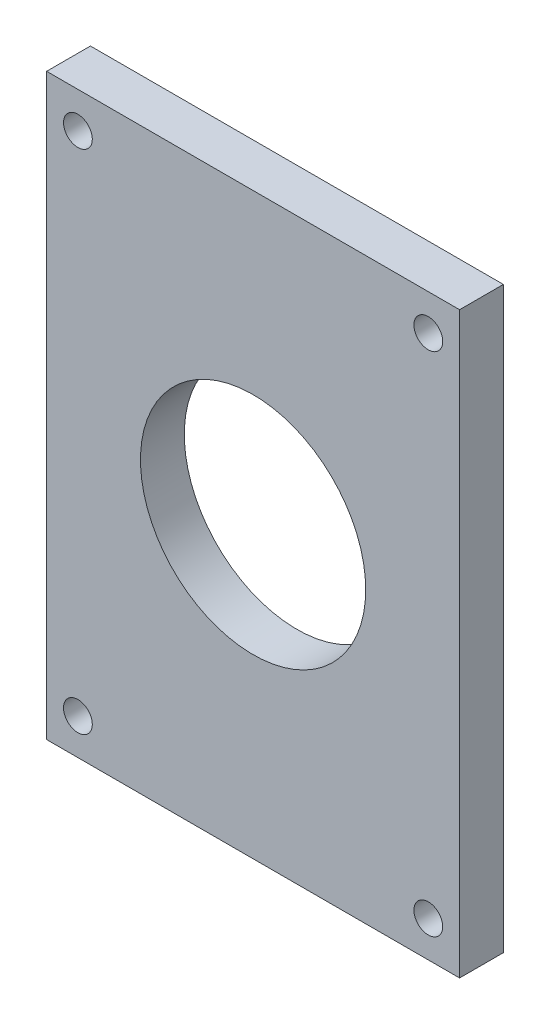
ISO-10303-21;
HEADER;
FILE_DESCRIPTION(('STEP AP214'),'2;1');
FILE_NAME('part.step','',(''),(''),'','','');
FILE_SCHEMA(('AUTOMOTIVE_DESIGN { 1 0 10303 214 1 1 1 1 }'));
ENDSEC;
DATA;
#1=APPLICATION_CONTEXT('core data for automotive mechanical design processes');
#2=APPLICATION_PROTOCOL_DEFINITION('international standard','automotive_design',2000,#1);
#3=PRODUCT_CONTEXT('',#1,'mechanical');
#4=PRODUCT('Part','Part','',(#3));
#5=PRODUCT_RELATED_PRODUCT_CATEGORY('part','',(#4));
#6=PRODUCT_DEFINITION_FORMATION('','',#4);
#7=PRODUCT_DEFINITION_CONTEXT('part definition',#1,'design');
#8=PRODUCT_DEFINITION('design','',#6,#7);
#9=PRODUCT_DEFINITION_SHAPE('','',#8);
#10=(LENGTH_UNIT() NAMED_UNIT(*) SI_UNIT(.MILLI.,.METRE.));
#11=(NAMED_UNIT(*) PLANE_ANGLE_UNIT() SI_UNIT($,.RADIAN.));
#12=(NAMED_UNIT(*) SI_UNIT($,.STERADIAN.) SOLID_ANGLE_UNIT());
#13=UNCERTAINTY_MEASURE_WITH_UNIT(LENGTH_MEASURE(1.E-05),#10,'distance_accuracy_value','');
#14=(GEOMETRIC_REPRESENTATION_CONTEXT(3) GLOBAL_UNCERTAINTY_ASSIGNED_CONTEXT((#13)) GLOBAL_UNIT_ASSIGNED_CONTEXT((#10,
#11,#12)) REPRESENTATION_CONTEXT('',''));
#15=CARTESIAN_POINT('',(0.,0.,0.));
#16=DIRECTION('',(0.,0.,1.));
#17=DIRECTION('',(1.,0.,0.));
#18=AXIS2_PLACEMENT_3D('',#15,#16,#17);
#19=CARTESIAN_POINT('',(0.,0.,65.));
#20=DIRECTION('',(0.,0.,1.));
#21=DIRECTION('',(1.,0.,0.));
#22=AXIS2_PLACEMENT_3D('',#19,#20,#21);
#23=PLANE('',#22);
#24=CARTESIAN_POINT('',(28.,-40.5,65.));
#25=DIRECTION('',(0.,0.,1.));
#26=DIRECTION('',(1.,0.,0.));
#27=AXIS2_PLACEMENT_3D('',#24,#25,#26);
#28=CIRCLE('',#27,2.3);
#29=CARTESIAN_POINT('',(30.3,-40.5,65.));
#30=VERTEX_POINT('',#29);
#31=EDGE_CURVE('E131',#30,#30,#28,.T.);
#32=ORIENTED_EDGE('',*,*,#31,.F.);
#33=EDGE_LOOP('',(#32));
#34=FACE_BOUND('',#33,.T.);
#35=CARTESIAN_POINT('',(-28.,-40.5,65.));
#36=DIRECTION('',(0.,0.,1.));
#37=DIRECTION('',(1.,0.,0.));
#38=AXIS2_PLACEMENT_3D('',#35,#36,#37);
#39=CIRCLE('',#38,2.3);
#40=CARTESIAN_POINT('',(-25.7,-40.5,65.));
#41=VERTEX_POINT('',#40);
#42=EDGE_CURVE('E122',#41,#41,#39,.T.);
#43=ORIENTED_EDGE('',*,*,#42,.F.);
#44=EDGE_LOOP('',(#43));
#45=FACE_BOUND('',#44,.T.);
#46=DIRECTION('',(0.,-1.,0.));
#47=VECTOR('',#46,1.);
#48=CARTESIAN_POINT('',(-33.,46.25,65.));
#49=LINE('',#48,#47);
#50=CARTESIAN_POINT('',(-33.,46.25,65.));
#51=VERTEX_POINT('',#50);
#52=CARTESIAN_POINT('',(-33.,-46.25,65.));
#53=VERTEX_POINT('',#52);
#54=EDGE_CURVE('E92',#51,#53,#49,.T.);
#55=ORIENTED_EDGE('',*,*,#54,.T.);
#56=DIRECTION('',(1.,0.,0.));
#57=VECTOR('',#56,1.);
#58=CARTESIAN_POINT('',(-33.,-46.25,65.));
#59=LINE('',#58,#57);
#60=CARTESIAN_POINT('',(33.,-46.25,65.));
#61=VERTEX_POINT('',#60);
#62=EDGE_CURVE('E88',#53,#61,#59,.T.);
#63=ORIENTED_EDGE('',*,*,#62,.T.);
#64=DIRECTION('',(0.,1.,0.));
#65=VECTOR('',#64,1.);
#66=CARTESIAN_POINT('',(33.,-46.25,65.));
#67=LINE('',#66,#65);
#68=CARTESIAN_POINT('',(33.,46.25,65.));
#69=VERTEX_POINT('',#68);
#70=EDGE_CURVE('E89',#61,#69,#67,.T.);
#71=ORIENTED_EDGE('',*,*,#70,.T.);
#72=DIRECTION('',(-1.,0.,0.));
#73=VECTOR('',#72,1.);
#74=CARTESIAN_POINT('',(33.,46.25,65.));
#75=LINE('',#74,#73);
#76=EDGE_CURVE('E57',#69,#51,#75,.T.);
#77=ORIENTED_EDGE('',*,*,#76,.T.);
#78=EDGE_LOOP('',(#55,#63,#71,#77));
#79=FACE_BOUND('',#78,.T.);
#80=CARTESIAN_POINT('',(0.,0.,65.));
#81=DIRECTION('',(0.,0.,1.));
#82=DIRECTION('',(1.,0.,0.));
#83=AXIS2_PLACEMENT_3D('',#80,#81,#82);
#84=CIRCLE('',#83,18.);
#85=CARTESIAN_POINT('',(18.,0.,65.));
#86=VERTEX_POINT('',#85);
#87=EDGE_CURVE('E106',#86,#86,#84,.T.);
#88=ORIENTED_EDGE('',*,*,#87,.F.);
#89=EDGE_LOOP('',(#88));
#90=FACE_BOUND('',#89,.T.);
#91=CARTESIAN_POINT('',(-28.,40.5,65.));
#92=DIRECTION('',(0.,0.,1.));
#93=DIRECTION('',(1.,0.,0.));
#94=AXIS2_PLACEMENT_3D('',#91,#92,#93);
#95=CIRCLE('',#94,2.3);
#96=CARTESIAN_POINT('',(-25.7,40.5,65.));
#97=VERTEX_POINT('',#96);
#98=EDGE_CURVE('E130',#97,#97,#95,.T.);
#99=ORIENTED_EDGE('',*,*,#98,.F.);
#100=EDGE_LOOP('',(#99));
#101=FACE_BOUND('',#100,.T.);
#102=CARTESIAN_POINT('',(28.,40.5,65.));
#103=DIRECTION('',(0.,0.,1.));
#104=DIRECTION('',(1.,0.,0.));
#105=AXIS2_PLACEMENT_3D('',#102,#103,#104);
#106=CIRCLE('',#105,2.3);
#107=CARTESIAN_POINT('',(30.3,40.5,65.));
#108=VERTEX_POINT('',#107);
#109=EDGE_CURVE('E139',#108,#108,#106,.T.);
#110=ORIENTED_EDGE('',*,*,#109,.F.);
#111=EDGE_LOOP('',(#110));
#112=FACE_BOUND('',#111,.T.);
#113=ADVANCED_FACE('F39',(#34,#45,#79,#90,#101,#112),#23,.T.);
#114=CARTESIAN_POINT('',(0.,0.,58.));
#115=DIRECTION('',(0.,0.,1.));
#116=DIRECTION('',(1.,0.,0.));
#117=AXIS2_PLACEMENT_3D('',#114,#115,#116);
#118=PLANE('',#117);
#119=DIRECTION('',(0.,-1.,0.));
#120=VECTOR('',#119,1.);
#121=CARTESIAN_POINT('',(-33.,46.25,58.));
#122=LINE('',#121,#120);
#123=CARTESIAN_POINT('',(-33.,46.25,58.));
#124=VERTEX_POINT('',#123);
#125=CARTESIAN_POINT('',(-33.,-46.25,58.));
#126=VERTEX_POINT('',#125);
#127=EDGE_CURVE('E101',#124,#126,#122,.T.);
#128=ORIENTED_EDGE('',*,*,#127,.F.);
#129=DIRECTION('',(-1.,0.,0.));
#130=VECTOR('',#129,1.);
#131=CARTESIAN_POINT('',(33.,46.25,58.));
#132=LINE('',#131,#130);
#133=CARTESIAN_POINT('',(33.,46.25,58.));
#134=VERTEX_POINT('',#133);
#135=EDGE_CURVE('E79',#134,#124,#132,.T.);
#136=ORIENTED_EDGE('',*,*,#135,.F.);
#137=DIRECTION('',(0.,1.,0.));
#138=VECTOR('',#137,1.);
#139=CARTESIAN_POINT('',(33.,-46.25,58.));
#140=LINE('',#139,#138);
#141=CARTESIAN_POINT('',(33.,-46.25,58.));
#142=VERTEX_POINT('',#141);
#143=EDGE_CURVE('E73',#142,#134,#140,.T.);
#144=ORIENTED_EDGE('',*,*,#143,.F.);
#145=DIRECTION('',(1.,0.,0.));
#146=VECTOR('',#145,1.);
#147=CARTESIAN_POINT('',(-33.,-46.25,58.));
#148=LINE('',#147,#146);
#149=EDGE_CURVE('E91',#126,#142,#148,.T.);
#150=ORIENTED_EDGE('',*,*,#149,.F.);
#151=EDGE_LOOP('',(#128,#136,#144,#150));
#152=FACE_BOUND('',#151,.T.);
#153=CARTESIAN_POINT('',(0.,0.,58.));
#154=DIRECTION('',(0.,0.,1.));
#155=DIRECTION('',(1.,0.,0.));
#156=AXIS2_PLACEMENT_3D('',#153,#154,#155);
#157=CIRCLE('',#156,18.);
#158=CARTESIAN_POINT('',(18.,0.,58.));
#159=VERTEX_POINT('',#158);
#160=EDGE_CURVE('E117',#159,#159,#157,.T.);
#161=ORIENTED_EDGE('',*,*,#160,.T.);
#162=EDGE_LOOP('',(#161));
#163=FACE_BOUND('',#162,.T.);
#164=CARTESIAN_POINT('',(-28.,-40.5,58.));
#165=DIRECTION('',(0.,0.,1.));
#166=DIRECTION('',(1.,0.,0.));
#167=AXIS2_PLACEMENT_3D('',#164,#165,#166);
#168=CIRCLE('',#167,2.3);
#169=CARTESIAN_POINT('',(-25.7,-40.5,58.));
#170=VERTEX_POINT('',#169);
#171=EDGE_CURVE('E121',#170,#170,#168,.T.);
#172=ORIENTED_EDGE('',*,*,#171,.T.);
#173=EDGE_LOOP('',(#172));
#174=FACE_BOUND('',#173,.T.);
#175=CARTESIAN_POINT('',(-28.,40.5,58.));
#176=DIRECTION('',(0.,0.,1.));
#177=DIRECTION('',(1.,0.,0.));
#178=AXIS2_PLACEMENT_3D('',#175,#176,#177);
#179=CIRCLE('',#178,2.3);
#180=CARTESIAN_POINT('',(-25.7,40.5,58.));
#181=VERTEX_POINT('',#180);
#182=EDGE_CURVE('E128',#181,#181,#179,.T.);
#183=ORIENTED_EDGE('',*,*,#182,.T.);
#184=EDGE_LOOP('',(#183));
#185=FACE_BOUND('',#184,.T.);
#186=CARTESIAN_POINT('',(28.,-40.5,58.));
#187=DIRECTION('',(0.,0.,1.));
#188=DIRECTION('',(1.,0.,0.));
#189=AXIS2_PLACEMENT_3D('',#186,#187,#188);
#190=CIRCLE('',#189,2.3);
#191=CARTESIAN_POINT('',(30.3,-40.5,58.));
#192=VERTEX_POINT('',#191);
#193=EDGE_CURVE('E137',#192,#192,#190,.T.);
#194=ORIENTED_EDGE('',*,*,#193,.T.);
#195=EDGE_LOOP('',(#194));
#196=FACE_BOUND('',#195,.T.);
#197=CARTESIAN_POINT('',(28.,40.5,58.));
#198=DIRECTION('',(0.,0.,1.));
#199=DIRECTION('',(1.,0.,0.));
#200=AXIS2_PLACEMENT_3D('',#197,#198,#199);
#201=CIRCLE('',#200,2.3);
#202=CARTESIAN_POINT('',(30.3,40.5,58.));
#203=VERTEX_POINT('',#202);
#204=EDGE_CURVE('E145',#203,#203,#201,.T.);
#205=ORIENTED_EDGE('',*,*,#204,.T.);
#206=EDGE_LOOP('',(#205));
#207=FACE_BOUND('',#206,.T.);
#208=ADVANCED_FACE('F112',(#152,#163,#174,#185,#196,#207),#118,.F.);
#209=CARTESIAN_POINT('',(-33.,46.25,65.));
#210=DIRECTION('',(1.,0.,0.));
#211=DIRECTION('',(0.,0.,-1.));
#212=AXIS2_PLACEMENT_3D('',#209,#210,#211);
#213=PLANE('',#212);
#214=ORIENTED_EDGE('',*,*,#127,.T.);
#215=DIRECTION('',(0.,0.,-1.));
#216=VECTOR('',#215,1.);
#217=CARTESIAN_POINT('',(-33.,-46.25,65.));
#218=LINE('',#217,#216);
#219=EDGE_CURVE('E11',#53,#126,#218,.T.);
#220=ORIENTED_EDGE('',*,*,#219,.F.);
#221=ORIENTED_EDGE('',*,*,#54,.F.);
#222=DIRECTION('',(0.,0.,-1.));
#223=VECTOR('',#222,1.);
#224=CARTESIAN_POINT('',(-33.,46.25,65.));
#225=LINE('',#224,#223);
#226=EDGE_CURVE('E100',#51,#124,#225,.T.);
#227=ORIENTED_EDGE('',*,*,#226,.T.);
#228=EDGE_LOOP('',(#214,#220,#221,#227));
#229=FACE_BOUND('',#228,.T.);
#230=ADVANCED_FACE('F41',(#229),#213,.F.);
#231=CARTESIAN_POINT('',(-33.,-46.25,65.));
#232=DIRECTION('',(0.,1.,0.));
#233=DIRECTION('',(0.,0.,1.));
#234=AXIS2_PLACEMENT_3D('',#231,#232,#233);
#235=PLANE('',#234);
#236=ORIENTED_EDGE('',*,*,#149,.T.);
#237=DIRECTION('',(0.,0.,-1.));
#238=VECTOR('',#237,1.);
#239=CARTESIAN_POINT('',(33.,-46.25,65.));
#240=LINE('',#239,#238);
#241=EDGE_CURVE('E48',#61,#142,#240,.T.);
#242=ORIENTED_EDGE('',*,*,#241,.F.);
#243=ORIENTED_EDGE('',*,*,#62,.F.);
#244=ORIENTED_EDGE('',*,*,#219,.T.);
#245=EDGE_LOOP('',(#236,#242,#243,#244));
#246=FACE_BOUND('',#245,.T.);
#247=ADVANCED_FACE('F94',(#246),#235,.F.);
#248=CARTESIAN_POINT('',(33.,-46.25,65.));
#249=DIRECTION('',(-1.,0.,0.));
#250=DIRECTION('',(0.,0.,1.));
#251=AXIS2_PLACEMENT_3D('',#248,#249,#250);
#252=PLANE('',#251);
#253=ORIENTED_EDGE('',*,*,#143,.T.);
#254=DIRECTION('',(0.,0.,-1.));
#255=VECTOR('',#254,1.);
#256=CARTESIAN_POINT('',(33.,46.25,65.));
#257=LINE('',#256,#255);
#258=EDGE_CURVE('E98',#69,#134,#257,.T.);
#259=ORIENTED_EDGE('',*,*,#258,.F.);
#260=ORIENTED_EDGE('',*,*,#70,.F.);
#261=ORIENTED_EDGE('',*,*,#241,.T.);
#262=EDGE_LOOP('',(#253,#259,#260,#261));
#263=FACE_BOUND('',#262,.T.);
#264=ADVANCED_FACE('F97',(#263),#252,.F.);
#265=CARTESIAN_POINT('',(33.,46.25,65.));
#266=DIRECTION('',(0.,-1.,0.));
#267=DIRECTION('',(0.,0.,-1.));
#268=AXIS2_PLACEMENT_3D('',#265,#266,#267);
#269=PLANE('',#268);
#270=ORIENTED_EDGE('',*,*,#135,.T.);
#271=ORIENTED_EDGE('',*,*,#226,.F.);
#272=ORIENTED_EDGE('',*,*,#76,.F.);
#273=ORIENTED_EDGE('',*,*,#258,.T.);
#274=EDGE_LOOP('',(#270,#271,#272,#273));
#275=FACE_BOUND('',#274,.T.);
#276=ADVANCED_FACE('F111',(#275),#269,.F.);
#277=CARTESIAN_POINT('',(0.,0.,65.));
#278=DIRECTION('',(0.,0.,-1.));
#279=DIRECTION('',(-1.,0.,0.));
#280=AXIS2_PLACEMENT_3D('',#277,#278,#279);
#281=CYLINDRICAL_SURFACE('',#280,18.);
#282=ORIENTED_EDGE('',*,*,#87,.T.);
#283=EDGE_LOOP('',(#282));
#284=FACE_BOUND('',#283,.T.);
#285=ORIENTED_EDGE('',*,*,#160,.F.);
#286=EDGE_LOOP('',(#285));
#287=FACE_BOUND('',#286,.T.);
#288=ADVANCED_FACE('F163',(#284,#287),#281,.F.);
#289=CARTESIAN_POINT('',(-28.,-40.5,65.));
#290=DIRECTION('',(0.,0.,-1.));
#291=DIRECTION('',(-1.,0.,0.));
#292=AXIS2_PLACEMENT_3D('',#289,#290,#291);
#293=CYLINDRICAL_SURFACE('',#292,2.3);
#294=ORIENTED_EDGE('',*,*,#42,.T.);
#295=EDGE_LOOP('',(#294));
#296=FACE_BOUND('',#295,.T.);
#297=ORIENTED_EDGE('',*,*,#171,.F.);
#298=EDGE_LOOP('',(#297));
#299=FACE_BOUND('',#298,.T.);
#300=ADVANCED_FACE('F207',(#296,#299),#293,.F.);
#301=CARTESIAN_POINT('',(-28.,40.5,65.));
#302=DIRECTION('',(0.,0.,-1.));
#303=DIRECTION('',(-1.,0.,0.));
#304=AXIS2_PLACEMENT_3D('',#301,#302,#303);
#305=CYLINDRICAL_SURFACE('',#304,2.3);
#306=ORIENTED_EDGE('',*,*,#98,.T.);
#307=EDGE_LOOP('',(#306));
#308=FACE_BOUND('',#307,.T.);
#309=ORIENTED_EDGE('',*,*,#182,.F.);
#310=EDGE_LOOP('',(#309));
#311=FACE_BOUND('',#310,.T.);
#312=ADVANCED_FACE('F211',(#308,#311),#305,.F.);
#313=CARTESIAN_POINT('',(28.,-40.5,65.));
#314=DIRECTION('',(0.,0.,-1.));
#315=DIRECTION('',(-1.,0.,0.));
#316=AXIS2_PLACEMENT_3D('',#313,#314,#315);
#317=CYLINDRICAL_SURFACE('',#316,2.3);
#318=ORIENTED_EDGE('',*,*,#31,.T.);
#319=EDGE_LOOP('',(#318));
#320=FACE_BOUND('',#319,.T.);
#321=ORIENTED_EDGE('',*,*,#193,.F.);
#322=EDGE_LOOP('',(#321));
#323=FACE_BOUND('',#322,.T.);
#324=ADVANCED_FACE('F225',(#320,#323),#317,.F.);
#325=CARTESIAN_POINT('',(28.,40.5,65.));
#326=DIRECTION('',(0.,0.,-1.));
#327=DIRECTION('',(-1.,0.,0.));
#328=AXIS2_PLACEMENT_3D('',#325,#326,#327);
#329=CYLINDRICAL_SURFACE('',#328,2.3);
#330=ORIENTED_EDGE('',*,*,#109,.T.);
#331=EDGE_LOOP('',(#330));
#332=FACE_BOUND('',#331,.T.);
#333=ORIENTED_EDGE('',*,*,#204,.F.);
#334=EDGE_LOOP('',(#333));
#335=FACE_BOUND('',#334,.T.);
#336=ADVANCED_FACE('F149',(#332,#335),#329,.F.);
#337=CLOSED_SHELL('',(#113,#208,#230,#247,#264,#276,#288,#300,#312,#324,#336));
#338=MANIFOLD_SOLID_BREP('B2',#337);
#339=ADVANCED_BREP_SHAPE_REPRESENTATION('',(#18,#338),#14);
#340=SHAPE_DEFINITION_REPRESENTATION(#9,#339);
ENDSEC;
END-ISO-10303-21;
